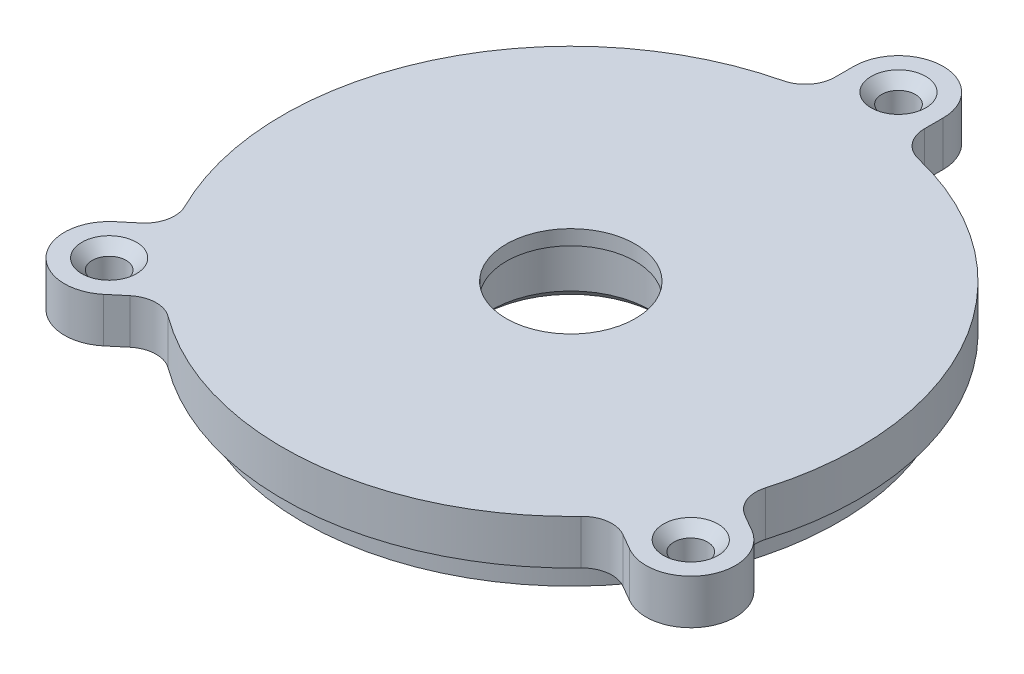
ISO-10303-21;
HEADER;
FILE_DESCRIPTION(('STEP AP214'),'2;1');
FILE_NAME('part.step','',(''),(''),'','','');
FILE_SCHEMA(('AUTOMOTIVE_DESIGN { 1 0 10303 214 1 1 1 1 }'));
ENDSEC;
DATA;
#1=APPLICATION_CONTEXT('core data for automotive mechanical design processes');
#2=APPLICATION_PROTOCOL_DEFINITION('international standard','automotive_design',2000,#1);
#3=PRODUCT_CONTEXT('',#1,'mechanical');
#4=PRODUCT('Part','Part','',(#3));
#5=PRODUCT_RELATED_PRODUCT_CATEGORY('part','',(#4));
#6=PRODUCT_DEFINITION_FORMATION('','',#4);
#7=PRODUCT_DEFINITION_CONTEXT('part definition',#1,'design');
#8=PRODUCT_DEFINITION('design','',#6,#7);
#9=PRODUCT_DEFINITION_SHAPE('','',#8);
#10=(LENGTH_UNIT() NAMED_UNIT(*) SI_UNIT(.MILLI.,.METRE.));
#11=(NAMED_UNIT(*) PLANE_ANGLE_UNIT() SI_UNIT($,.RADIAN.));
#12=(NAMED_UNIT(*) SI_UNIT($,.STERADIAN.) SOLID_ANGLE_UNIT());
#13=UNCERTAINTY_MEASURE_WITH_UNIT(LENGTH_MEASURE(1.E-05),#10,'distance_accuracy_value','');
#14=(GEOMETRIC_REPRESENTATION_CONTEXT(3) GLOBAL_UNCERTAINTY_ASSIGNED_CONTEXT((#13)) GLOBAL_UNIT_ASSIGNED_CONTEXT((#10,
#11,#12)) REPRESENTATION_CONTEXT('',''));
#15=CARTESIAN_POINT('',(0.,0.,0.));
#16=DIRECTION('',(0.,0.,1.));
#17=DIRECTION('',(1.,0.,0.));
#18=AXIS2_PLACEMENT_3D('',#15,#16,#17);
#19=CARTESIAN_POINT('',(0.,16.3185634778856,0.));
#20=DIRECTION('',(0.,1.,0.));
#21=DIRECTION('',(0.,0.,1.));
#22=AXIS2_PLACEMENT_3D('',#19,#20,#21);
#23=CYLINDRICAL_SURFACE('',#22,29.);
#24=CARTESIAN_POINT('',(0.,7.5,0.));
#25=DIRECTION('',(0.,1.,0.));
#26=DIRECTION('',(0.,0.,1.));
#27=AXIS2_PLACEMENT_3D('',#24,#25,#26);
#28=CIRCLE('',#27,29.);
#29=CARTESIAN_POINT('',(-17.2275630338086,7.5,23.3283319574322));
#30=VERTEX_POINT('',#29);
#31=CARTESIAN_POINT('',(21.0167599736183,7.5,19.9823872500589));
#32=VERTEX_POINT('',#31);
#33=EDGE_CURVE('E261',#30,#32,#28,.T.);
#34=ORIENTED_EDGE('',*,*,#33,.F.);
#35=DIRECTION('',(0.,1.,0.));
#36=VECTOR('',#35,1.);
#37=CARTESIAN_POINT('',(-17.2275630338086,16.3185634778856,23.3283319574322));
#38=LINE('',#37,#36);
#39=CARTESIAN_POINT('',(-17.2275630338086,3.,23.3283319574322));
#40=VERTEX_POINT('',#39);
#41=EDGE_CURVE('E66',#30,#40,#38,.F.);
#42=ORIENTED_EDGE('',*,*,#41,.T.);
#43=CARTESIAN_POINT('',(0.,3.,0.));
#44=DIRECTION('',(0.,1.,0.));
#45=DIRECTION('',(0.,0.,1.));
#46=AXIS2_PLACEMENT_3D('',#43,#44,#45);
#47=CIRCLE('',#46,29.);
#48=CARTESIAN_POINT('',(21.0167599736183,3.,19.9823872500589));
#49=VERTEX_POINT('',#48);
#50=EDGE_CURVE('E256',#40,#49,#47,.T.);
#51=ORIENTED_EDGE('',*,*,#50,.T.);
#52=DIRECTION('',(0.,1.,0.));
#53=VECTOR('',#52,1.);
#54=CARTESIAN_POINT('',(21.0167599736183,16.3185634778856,19.9823872500589));
#55=LINE('',#54,#53);
#56=EDGE_CURVE('E298',#49,#32,#55,.T.);
#57=ORIENTED_EDGE('',*,*,#56,.T.);
#58=EDGE_LOOP('',(#34,#42,#51,#57));
#59=FACE_BOUND('',#58,.T.);
#60=ADVANCED_FACE('F43',(#59),#23,.T.);
#61=CARTESIAN_POINT('',(27.8136349736183,7.5,8.20985441736422));
#62=VERTEX_POINT('',#61);
#63=CARTESIAN_POINT('',(6.796875,7.5,-28.1922416674229));
#64=VERTEX_POINT('',#63);
#65=EDGE_CURVE('E255',#62,#64,#28,.T.);
#66=ORIENTED_EDGE('',*,*,#65,.F.);
#67=DIRECTION('',(0.,1.,0.));
#68=VECTOR('',#67,1.);
#69=CARTESIAN_POINT('',(27.8136349736183,16.3185634778856,8.20985441736421));
#70=LINE('',#69,#68);
#71=CARTESIAN_POINT('',(27.8136349736183,3.,8.20985441736422));
#72=VERTEX_POINT('',#71);
#73=EDGE_CURVE('E306',#62,#72,#70,.F.);
#74=ORIENTED_EDGE('',*,*,#73,.T.);
#75=CARTESIAN_POINT('',(6.796875,3.,-28.1922416674229));
#76=VERTEX_POINT('',#75);
#77=EDGE_CURVE('E251',#72,#76,#47,.T.);
#78=ORIENTED_EDGE('',*,*,#77,.T.);
#79=DIRECTION('',(0.,1.,0.));
#80=VECTOR('',#79,1.);
#81=CARTESIAN_POINT('',(6.796875,16.3185634778856,-28.1922416674229));
#82=LINE('',#81,#80);
#83=EDGE_CURVE('E281',#76,#64,#82,.T.);
#84=ORIENTED_EDGE('',*,*,#83,.T.);
#85=EDGE_LOOP('',(#66,#74,#78,#84));
#86=FACE_BOUND('',#85,.T.);
#87=ADVANCED_FACE('F363',(#86),#23,.T.);
#88=CARTESIAN_POINT('',(0.,16.3185634778856,0.));
#89=DIRECTION('',(0.,1.,0.));
#90=DIRECTION('',(0.,0.,1.));
#91=AXIS2_PLACEMENT_3D('',#88,#89,#90);
#92=CYLINDRICAL_SURFACE('',#91,27.);
#93=CARTESIAN_POINT('',(0.,3.,0.));
#94=DIRECTION('',(0.,1.,0.));
#95=DIRECTION('',(0.,0.,1.));
#96=AXIS2_PLACEMENT_3D('',#93,#94,#95);
#97=CIRCLE('',#96,27.);
#98=CARTESIAN_POINT('',(0.,3.,27.));
#99=VERTEX_POINT('',#98);
#100=EDGE_CURVE('E248',#99,#99,#97,.T.);
#101=ORIENTED_EDGE('',*,*,#100,.F.);
#102=EDGE_LOOP('',(#101));
#103=FACE_BOUND('',#102,.T.);
#104=CARTESIAN_POINT('',(0.,0.,0.));
#105=DIRECTION('',(0.,1.,0.));
#106=DIRECTION('',(0.,0.,1.));
#107=AXIS2_PLACEMENT_3D('',#104,#105,#106);
#108=CIRCLE('',#107,27.);
#109=CARTESIAN_POINT('',(0.,0.,27.));
#110=VERTEX_POINT('',#109);
#111=EDGE_CURVE('E276',#110,#110,#108,.T.);
#112=ORIENTED_EDGE('',*,*,#111,.T.);
#113=EDGE_LOOP('',(#112));
#114=FACE_BOUND('',#113,.T.);
#115=ADVANCED_FACE('F370',(#103,#114),#92,.T.);
#116=CARTESIAN_POINT('',(9.,0.,0.));
#117=DIRECTION('',(0.,1.,0.));
#118=DIRECTION('',(0.,0.,1.));
#119=AXIS2_PLACEMENT_3D('',#116,#117,#118);
#120=PLANE('',#119);
#121=ORIENTED_EDGE('',*,*,#111,.F.);
#122=EDGE_LOOP('',(#121));
#123=FACE_BOUND('',#122,.T.);
#124=CARTESIAN_POINT('',(0.,0.,0.));
#125=DIRECTION('',(0.,1.,0.));
#126=DIRECTION('',(0.,0.,1.));
#127=AXIS2_PLACEMENT_3D('',#124,#125,#126);
#128=CIRCLE('',#127,9.);
#129=CARTESIAN_POINT('',(0.,0.,9.));
#130=VERTEX_POINT('',#129);
#131=EDGE_CURVE('E273',#130,#130,#128,.T.);
#132=ORIENTED_EDGE('',*,*,#131,.T.);
#133=EDGE_LOOP('',(#132));
#134=FACE_BOUND('',#133,.T.);
#135=ADVANCED_FACE('F436',(#123,#134),#120,.F.);
#136=CARTESIAN_POINT('',(0.,1.,0.));
#137=DIRECTION('',(0.,-1.,0.));
#138=DIRECTION('',(0.,0.,-1.));
#139=AXIS2_PLACEMENT_3D('',#136,#137,#138);
#140=CONICAL_SURFACE('',#139,8.,0.785398163397446);
#141=ORIENTED_EDGE('',*,*,#131,.F.);
#142=EDGE_LOOP('',(#141));
#143=FACE_BOUND('',#142,.T.);
#144=CARTESIAN_POINT('',(0.,1.,0.));
#145=DIRECTION('',(0.,1.,0.));
#146=DIRECTION('',(0.,0.,1.));
#147=AXIS2_PLACEMENT_3D('',#144,#145,#146);
#148=CIRCLE('',#147,8.);
#149=CARTESIAN_POINT('',(0.,1.,8.));
#150=VERTEX_POINT('',#149);
#151=EDGE_CURVE('E270',#150,#150,#148,.T.);
#152=ORIENTED_EDGE('',*,*,#151,.T.);
#153=EDGE_LOOP('',(#152));
#154=FACE_BOUND('',#153,.T.);
#155=ADVANCED_FACE('F440',(#143,#154),#140,.F.);
#156=CARTESIAN_POINT('',(0.,16.3185634778856,0.));
#157=DIRECTION('',(0.,1.,0.));
#158=DIRECTION('',(0.,0.,1.));
#159=AXIS2_PLACEMENT_3D('',#156,#157,#158);
#160=CYLINDRICAL_SURFACE('',#159,8.);
#161=ORIENTED_EDGE('',*,*,#151,.F.);
#162=EDGE_LOOP('',(#161));
#163=FACE_BOUND('',#162,.T.);
#164=CARTESIAN_POINT('',(0.,6.,0.));
#165=DIRECTION('',(0.,1.,0.));
#166=DIRECTION('',(0.,0.,1.));
#167=AXIS2_PLACEMENT_3D('',#164,#165,#166);
#168=CIRCLE('',#167,8.);
#169=CARTESIAN_POINT('',(0.,6.,8.));
#170=VERTEX_POINT('',#169);
#171=EDGE_CURVE('E267',#170,#170,#168,.T.);
#172=ORIENTED_EDGE('',*,*,#171,.T.);
#173=EDGE_LOOP('',(#172));
#174=FACE_BOUND('',#173,.T.);
#175=ADVANCED_FACE('F444',(#163,#174),#160,.F.);
#176=CARTESIAN_POINT('',(6.5,6.,0.));
#177=DIRECTION('',(0.,1.,0.));
#178=DIRECTION('',(0.,0.,1.));
#179=AXIS2_PLACEMENT_3D('',#176,#177,#178);
#180=PLANE('',#179);
#181=ORIENTED_EDGE('',*,*,#171,.F.);
#182=EDGE_LOOP('',(#181));
#183=FACE_BOUND('',#182,.T.);
#184=CARTESIAN_POINT('',(0.,6.,0.));
#185=DIRECTION('',(0.,1.,0.));
#186=DIRECTION('',(0.,0.,1.));
#187=AXIS2_PLACEMENT_3D('',#184,#185,#186);
#188=CIRCLE('',#187,6.5);
#189=CARTESIAN_POINT('',(0.,6.,6.5));
#190=VERTEX_POINT('',#189);
#191=EDGE_CURVE('E264',#190,#190,#188,.T.);
#192=ORIENTED_EDGE('',*,*,#191,.T.);
#193=EDGE_LOOP('',(#192));
#194=FACE_BOUND('',#193,.T.);
#195=ADVANCED_FACE('F448',(#183,#194),#180,.F.);
#196=CARTESIAN_POINT('',(0.,16.3185634778856,0.));
#197=DIRECTION('',(0.,1.,0.));
#198=DIRECTION('',(0.,0.,1.));
#199=AXIS2_PLACEMENT_3D('',#196,#197,#198);
#200=CYLINDRICAL_SURFACE('',#199,6.5);
#201=ORIENTED_EDGE('',*,*,#191,.F.);
#202=EDGE_LOOP('',(#201));
#203=FACE_BOUND('',#202,.T.);
#204=CARTESIAN_POINT('',(0.,7.5,0.));
#205=DIRECTION('',(0.,1.,0.));
#206=DIRECTION('',(0.,0.,1.));
#207=AXIS2_PLACEMENT_3D('',#204,#205,#206);
#208=CIRCLE('',#207,6.5);
#209=CARTESIAN_POINT('',(0.,7.5,6.5));
#210=VERTEX_POINT('',#209);
#211=EDGE_CURVE('E260',#210,#210,#208,.T.);
#212=ORIENTED_EDGE('',*,*,#211,.T.);
#213=EDGE_LOOP('',(#212));
#214=FACE_BOUND('',#213,.T.);
#215=ADVANCED_FACE('F383',(#203,#214),#200,.F.);
#216=CARTESIAN_POINT('',(29.,7.5,0.));
#217=DIRECTION('',(0.,-1.,0.));
#218=DIRECTION('',(0.,0.,-1.));
#219=AXIS2_PLACEMENT_3D('',#216,#217,#218);
#220=PLANE('',#219);
#221=CARTESIAN_POINT('',(-25.2794666229265,7.5,21.2119911196556));
#222=DIRECTION('',(0.,-1.,0.));
#223=DIRECTION('',(0.,0.,-1.));
#224=AXIS2_PLACEMENT_3D('',#221,#222,#223);
#225=CIRCLE('',#224,2.75);
#226=CARTESIAN_POINT('',(-25.2794666229265,7.5,18.4619911196556));
#227=VERTEX_POINT('',#226);
#228=EDGE_CURVE('E340',#227,#227,#225,.T.);
#229=ORIENTED_EDGE('',*,*,#228,.T.);
#230=EDGE_LOOP('',(#229));
#231=FACE_BOUND('',#230,.T.);
#232=CARTESIAN_POINT('',(28.5788383248864,7.5,16.5000000000001));
#233=DIRECTION('',(0.,-1.,0.));
#234=DIRECTION('',(0.,0.,-1.));
#235=AXIS2_PLACEMENT_3D('',#232,#233,#234);
#236=CIRCLE('',#235,2.75000000000001);
#237=CARTESIAN_POINT('',(28.5788383248864,7.5,13.7500000000001));
#238=VERTEX_POINT('',#237);
#239=EDGE_CURVE('E337',#238,#238,#236,.T.);
#240=ORIENTED_EDGE('',*,*,#239,.T.);
#241=EDGE_LOOP('',(#240));
#242=FACE_BOUND('',#241,.T.);
#243=CARTESIAN_POINT('',(0.,7.5,-33.));
#244=DIRECTION('',(0.,-1.,0.));
#245=DIRECTION('',(0.,0.,-1.));
#246=AXIS2_PLACEMENT_3D('',#243,#244,#245);
#247=CIRCLE('',#246,2.74999999999999);
#248=CARTESIAN_POINT('',(0.,7.5,-35.75));
#249=VERTEX_POINT('',#248);
#250=EDGE_CURVE('E334',#249,#249,#247,.T.);
#251=ORIENTED_EDGE('',*,*,#250,.T.);
#252=EDGE_LOOP('',(#251));
#253=FACE_BOUND('',#252,.T.);
#254=ORIENTED_EDGE('',*,*,#211,.F.);
#255=EDGE_LOOP('',(#254));
#256=FACE_BOUND('',#255,.T.);
#257=DIRECTION('',(0.,0.,1.));
#258=VECTOR('',#257,1.);
#259=CARTESIAN_POINT('',(-4.5,7.5,-33.));
#260=LINE('',#259,#258);
#261=CARTESIAN_POINT('',(-4.5,7.5,-33.));
#262=VERTEX_POINT('',#261);
#263=CARTESIAN_POINT('',(-4.5,7.5,-31.1086804606046));
#264=VERTEX_POINT('',#263);
#265=EDGE_CURVE('E238',#262,#264,#260,.T.);
#266=ORIENTED_EDGE('',*,*,#265,.T.);
#267=CARTESIAN_POINT('',(-7.5,7.5,-31.1086804606046));
#268=DIRECTION('',(0.,-1.,0.));
#269=DIRECTION('',(0.,0.,-1.));
#270=AXIS2_PLACEMENT_3D('',#267,#268,#269);
#271=CIRCLE('',#270,3.);
#272=CARTESIAN_POINT('',(-6.796875,7.5,-28.1922416674229));
#273=VERTEX_POINT('',#272);
#274=EDGE_CURVE('E294',#264,#273,#271,.T.);
#275=ORIENTED_EDGE('',*,*,#274,.T.);
#276=CARTESIAN_POINT('',(-25.9654571029849,7.5,12.9149153087835));
#277=VERTEX_POINT('',#276);
#278=EDGE_CURVE('E257',#273,#277,#28,.T.);
#279=ORIENTED_EDGE('',*,*,#278,.T.);
#280=CARTESIAN_POINT('',(-28.6515388722592,7.5,14.2509410303818));
#281=DIRECTION('',(0.,-1.,0.));
#282=DIRECTION('',(0.,0.,-1.));
#283=AXIS2_PLACEMENT_3D('',#280,#281,#282);
#284=CIRCLE('',#283,3.);
#285=CARTESIAN_POINT('',(-26.7231760431996,7.5,16.5490743597387));
#286=VERTEX_POINT('',#285);
#287=EDGE_CURVE('E324',#277,#286,#284,.T.);
#288=ORIENTED_EDGE('',*,*,#287,.T.);
#289=DIRECTION('',(-0.766044443118984,0.,0.642787609686532));
#290=VECTOR('',#289,1.);
#291=CARTESIAN_POINT('',(-28.1720108665159,7.5,17.7647911256201));
#292=LINE('',#291,#290);
#293=CARTESIAN_POINT('',(-28.1720108665159,7.5,17.7647911256201));
#294=VERTEX_POINT('',#293);
#295=EDGE_CURVE('E180',#286,#294,#292,.T.);
#296=ORIENTED_EDGE('',*,*,#295,.T.);
#297=CARTESIAN_POINT('',(-25.2794666229265,7.5,21.2119911196556));
#298=DIRECTION('',(0.,1.,0.));
#299=DIRECTION('',(0.766044443118984,0.,-0.642787609686532));
#300=AXIS2_PLACEMENT_3D('',#297,#298,#299);
#301=CIRCLE('',#300,4.5);
#302=CARTESIAN_POINT('',(-22.3869223793371,7.5,24.659191113691));
#303=VERTEX_POINT('',#302);
#304=EDGE_CURVE('E175',#294,#303,#301,.T.);
#305=ORIENTED_EDGE('',*,*,#304,.T.);
#306=DIRECTION('',(0.766044443118984,0.,-0.642787609686532));
#307=VECTOR('',#306,1.);
#308=CARTESIAN_POINT('',(-22.3869223793371,7.5,24.659191113691));
#309=LINE('',#308,#307);
#310=CARTESIAN_POINT('',(-20.9380875560209,7.5,23.4434743478096));
#311=VERTEX_POINT('',#310);
#312=EDGE_CURVE('E183',#303,#311,#309,.T.);
#313=ORIENTED_EDGE('',*,*,#312,.T.);
#314=CARTESIAN_POINT('',(-19.0097247269613,7.5,25.7416076771665));
#315=DIRECTION('',(0.,-1.,0.));
#316=DIRECTION('',(0.,0.,-1.));
#317=AXIS2_PLACEMENT_3D('',#314,#315,#316);
#318=CIRCLE('',#317,3.);
#319=EDGE_CURVE('E59',#311,#30,#318,.T.);
#320=ORIENTED_EDGE('',*,*,#319,.T.);
#321=ORIENTED_EDGE('',*,*,#33,.T.);
#322=CARTESIAN_POINT('',(23.190907557096,7.5,22.0495307586857));
#323=DIRECTION('',(0.,-1.,0.));
#324=DIRECTION('',(0.,0.,-1.));
#325=AXIS2_PLACEMENT_3D('',#322,#323,#324);
#326=CIRCLE('',#325,3.);
#327=CARTESIAN_POINT('',(24.690907557096,7.5,19.4514545473324));
#328=VERTEX_POINT('',#327);
#329=EDGE_CURVE('E308',#32,#328,#326,.T.);
#330=ORIENTED_EDGE('',*,*,#329,.T.);
#331=DIRECTION('',(0.866025403784436,0.,0.500000000000004));
#332=VECTOR('',#331,1.);
#333=CARTESIAN_POINT('',(26.3288383248864,7.5,20.3971143170301));
#334=LINE('',#333,#332);
#335=CARTESIAN_POINT('',(26.3288383248864,7.5,20.3971143170301));
#336=VERTEX_POINT('',#335);
#337=EDGE_CURVE('E218',#328,#336,#334,.T.);
#338=ORIENTED_EDGE('',*,*,#337,.T.);
#339=CARTESIAN_POINT('',(28.5788383248864,7.5,16.5000000000001));
#340=DIRECTION('',(0.,1.,0.));
#341=DIRECTION('',(-0.866025403784436,0.,-0.500000000000004));
#342=AXIS2_PLACEMENT_3D('',#339,#340,#341);
#343=CIRCLE('',#342,4.5);
#344=CARTESIAN_POINT('',(30.8288383248864,7.5,12.6028856829702));
#345=VERTEX_POINT('',#344);
#346=EDGE_CURVE('E202',#336,#345,#343,.T.);
#347=ORIENTED_EDGE('',*,*,#346,.T.);
#348=DIRECTION('',(-0.866025403784437,0.,-0.500000000000004));
#349=VECTOR('',#348,1.);
#350=CARTESIAN_POINT('',(30.8288383248864,7.5,12.6028856829702));
#351=LINE('',#350,#349);
#352=CARTESIAN_POINT('',(29.1909075570961,7.5,11.6572259132724));
#353=VERTEX_POINT('',#352);
#354=EDGE_CURVE('E215',#345,#353,#351,.T.);
#355=ORIENTED_EDGE('',*,*,#354,.T.);
#356=CARTESIAN_POINT('',(30.6909075570961,7.5,9.05914970191913));
#357=DIRECTION('',(0.,-1.,0.));
#358=DIRECTION('',(0.,0.,-1.));
#359=AXIS2_PLACEMENT_3D('',#356,#357,#358);
#360=CIRCLE('',#359,3.);
#361=EDGE_CURVE('E313',#353,#62,#360,.T.);
#362=ORIENTED_EDGE('',*,*,#361,.T.);
#363=ORIENTED_EDGE('',*,*,#65,.T.);
#364=CARTESIAN_POINT('',(7.5,7.5,-31.1086804606046));
#365=DIRECTION('',(0.,-1.,0.));
#366=DIRECTION('',(0.,0.,-1.));
#367=AXIS2_PLACEMENT_3D('',#364,#365,#366);
#368=CIRCLE('',#367,3.);
#369=CARTESIAN_POINT('',(4.5,7.5,-31.1086804606046));
#370=VERTEX_POINT('',#369);
#371=EDGE_CURVE('E289',#64,#370,#368,.T.);
#372=ORIENTED_EDGE('',*,*,#371,.T.);
#373=DIRECTION('',(0.,0.,-1.));
#374=VECTOR('',#373,1.);
#375=CARTESIAN_POINT('',(4.5,7.5,-33.));
#376=LINE('',#375,#374);
#377=CARTESIAN_POINT('',(4.5,7.5,-33.));
#378=VERTEX_POINT('',#377);
#379=EDGE_CURVE('E240',#370,#378,#376,.T.);
#380=ORIENTED_EDGE('',*,*,#379,.T.);
#381=CARTESIAN_POINT('',(0.,7.5,-33.));
#382=DIRECTION('',(0.,1.,0.));
#383=DIRECTION('',(0.,0.,1.));
#384=AXIS2_PLACEMENT_3D('',#381,#382,#383);
#385=CIRCLE('',#384,4.5);
#386=EDGE_CURVE('E226',#378,#262,#385,.T.);
#387=ORIENTED_EDGE('',*,*,#386,.T.);
#388=EDGE_LOOP('',(#266,#275,#279,#288,#296,#305,#313,#320,#321,#330,#338,#347,#355,#362,#363,
#372,#380,#387));
#389=FACE_BOUND('',#388,.T.);
#390=ADVANCED_FACE('F189',(#231,#242,#253,#256,#389),#220,.F.);
#391=CARTESIAN_POINT('',(-6.796875,3.,-28.1922416674229));
#392=VERTEX_POINT('',#391);
#393=CARTESIAN_POINT('',(-25.9654571029849,3.,12.9149153087835));
#394=VERTEX_POINT('',#393);
#395=EDGE_CURVE('E252',#392,#394,#47,.T.);
#396=ORIENTED_EDGE('',*,*,#395,.T.);
#397=DIRECTION('',(0.,1.,0.));
#398=VECTOR('',#397,1.);
#399=CARTESIAN_POINT('',(-25.9654571029849,16.3185634778856,12.9149153087835));
#400=LINE('',#399,#398);
#401=EDGE_CURVE('E317',#394,#277,#400,.T.);
#402=ORIENTED_EDGE('',*,*,#401,.T.);
#403=ORIENTED_EDGE('',*,*,#278,.F.);
#404=DIRECTION('',(0.,1.,0.));
#405=VECTOR('',#404,1.);
#406=CARTESIAN_POINT('',(-6.796875,16.3185634778856,-28.1922416674229));
#407=LINE('',#406,#405);
#408=EDGE_CURVE('E279',#273,#392,#407,.F.);
#409=ORIENTED_EDGE('',*,*,#408,.T.);
#410=EDGE_LOOP('',(#396,#402,#403,#409));
#411=FACE_BOUND('',#410,.T.);
#412=ADVANCED_FACE('F365',(#411),#23,.T.);
#413=CARTESIAN_POINT('',(27.,3.,0.));
#414=DIRECTION('',(0.,1.,0.));
#415=DIRECTION('',(0.,0.,1.));
#416=AXIS2_PLACEMENT_3D('',#413,#414,#415);
#417=PLANE('',#416);
#418=ORIENTED_EDGE('',*,*,#395,.F.);
#419=CARTESIAN_POINT('',(-7.5,3.,-31.1086804606046));
#420=DIRECTION('',(0.,1.,0.));
#421=DIRECTION('',(0.,0.,1.));
#422=AXIS2_PLACEMENT_3D('',#419,#420,#421);
#423=CIRCLE('',#422,3.);
#424=CARTESIAN_POINT('',(-4.5,3.,-31.1086804606046));
#425=VERTEX_POINT('',#424);
#426=EDGE_CURVE('E296',#392,#425,#423,.T.);
#427=ORIENTED_EDGE('',*,*,#426,.T.);
#428=DIRECTION('',(0.,0.,-1.));
#429=VECTOR('',#428,1.);
#430=CARTESIAN_POINT('',(-4.5,3.,-33.));
#431=LINE('',#430,#429);
#432=CARTESIAN_POINT('',(-4.5,3.,-33.));
#433=VERTEX_POINT('',#432);
#434=EDGE_CURVE('E227',#425,#433,#431,.T.);
#435=ORIENTED_EDGE('',*,*,#434,.T.);
#436=CARTESIAN_POINT('',(0.,3.,-33.));
#437=DIRECTION('',(0.,1.,0.));
#438=DIRECTION('',(0.,0.,1.));
#439=AXIS2_PLACEMENT_3D('',#436,#437,#438);
#440=CIRCLE('',#439,4.5);
#441=CARTESIAN_POINT('',(4.5,3.,-33.));
#442=VERTEX_POINT('',#441);
#443=EDGE_CURVE('E230',#433,#442,#440,.F.);
#444=ORIENTED_EDGE('',*,*,#443,.T.);
#445=DIRECTION('',(0.,0.,1.));
#446=VECTOR('',#445,1.);
#447=CARTESIAN_POINT('',(4.5,3.,-33.));
#448=LINE('',#447,#446);
#449=CARTESIAN_POINT('',(4.5,3.,-31.1086804606046));
#450=VERTEX_POINT('',#449);
#451=EDGE_CURVE('E231',#442,#450,#448,.T.);
#452=ORIENTED_EDGE('',*,*,#451,.T.);
#453=CARTESIAN_POINT('',(7.5,3.,-31.1086804606046));
#454=DIRECTION('',(0.,1.,0.));
#455=DIRECTION('',(0.,0.,1.));
#456=AXIS2_PLACEMENT_3D('',#453,#454,#455);
#457=CIRCLE('',#456,3.);
#458=EDGE_CURVE('E291',#450,#76,#457,.T.);
#459=ORIENTED_EDGE('',*,*,#458,.T.);
#460=ORIENTED_EDGE('',*,*,#77,.F.);
#461=CARTESIAN_POINT('',(30.6909075570961,3.,9.05914970191913));
#462=DIRECTION('',(0.,1.,0.));
#463=DIRECTION('',(0.,0.,1.));
#464=AXIS2_PLACEMENT_3D('',#461,#462,#463);
#465=CIRCLE('',#464,3.);
#466=CARTESIAN_POINT('',(29.1909075570961,3.,11.6572259132724));
#467=VERTEX_POINT('',#466);
#468=EDGE_CURVE('E315',#72,#467,#465,.T.);
#469=ORIENTED_EDGE('',*,*,#468,.T.);
#470=DIRECTION('',(0.866025403784436,0.,0.500000000000004));
#471=VECTOR('',#470,1.);
#472=CARTESIAN_POINT('',(30.8288383248864,3.,12.6028856829702));
#473=LINE('',#472,#471);
#474=CARTESIAN_POINT('',(30.8288383248864,3.,12.6028856829702));
#475=VERTEX_POINT('',#474);
#476=EDGE_CURVE('E204',#467,#475,#473,.T.);
#477=ORIENTED_EDGE('',*,*,#476,.T.);
#478=CARTESIAN_POINT('',(28.5788383248864,3.,16.5000000000001));
#479=DIRECTION('',(0.,1.,0.));
#480=DIRECTION('',(0.,0.,1.));
#481=AXIS2_PLACEMENT_3D('',#478,#479,#480);
#482=CIRCLE('',#481,4.5);
#483=CARTESIAN_POINT('',(26.3288383248864,3.,20.3971143170301));
#484=VERTEX_POINT('',#483);
#485=EDGE_CURVE('E207',#475,#484,#482,.F.);
#486=ORIENTED_EDGE('',*,*,#485,.T.);
#487=DIRECTION('',(-0.866025403784436,0.,-0.500000000000004));
#488=VECTOR('',#487,1.);
#489=CARTESIAN_POINT('',(26.3288383248864,3.,20.3971143170301));
#490=LINE('',#489,#488);
#491=CARTESIAN_POINT('',(24.690907557096,3.,19.4514545473324));
#492=VERTEX_POINT('',#491);
#493=EDGE_CURVE('E208',#484,#492,#490,.T.);
#494=ORIENTED_EDGE('',*,*,#493,.T.);
#495=CARTESIAN_POINT('',(23.190907557096,3.,22.0495307586857));
#496=DIRECTION('',(0.,1.,0.));
#497=DIRECTION('',(0.,0.,1.));
#498=AXIS2_PLACEMENT_3D('',#495,#496,#497);
#499=CIRCLE('',#498,3.);
#500=EDGE_CURVE('E310',#492,#49,#499,.T.);
#501=ORIENTED_EDGE('',*,*,#500,.T.);
#502=ORIENTED_EDGE('',*,*,#50,.F.);
#503=CARTESIAN_POINT('',(-19.0097247269613,3.,25.7416076771665));
#504=DIRECTION('',(0.,1.,0.));
#505=DIRECTION('',(0.,0.,1.));
#506=AXIS2_PLACEMENT_3D('',#503,#504,#505);
#507=CIRCLE('',#506,3.);
#508=CARTESIAN_POINT('',(-20.9380875560209,3.,23.4434743478096));
#509=VERTEX_POINT('',#508);
#510=EDGE_CURVE('E329',#40,#509,#507,.T.);
#511=ORIENTED_EDGE('',*,*,#510,.T.);
#512=DIRECTION('',(-0.766044443118984,0.,0.642787609686532));
#513=VECTOR('',#512,1.);
#514=CARTESIAN_POINT('',(-22.3869223793371,3.,24.659191113691));
#515=LINE('',#514,#513);
#516=CARTESIAN_POINT('',(-22.3869223793371,3.,24.659191113691));
#517=VERTEX_POINT('',#516);
#518=EDGE_CURVE('E203',#509,#517,#515,.T.);
#519=ORIENTED_EDGE('',*,*,#518,.T.);
#520=CARTESIAN_POINT('',(-25.2794666229265,3.,21.2119911196556));
#521=DIRECTION('',(0.,1.,0.));
#522=DIRECTION('',(0.,0.,1.));
#523=AXIS2_PLACEMENT_3D('',#520,#521,#522);
#524=CIRCLE('',#523,4.5);
#525=CARTESIAN_POINT('',(-28.1720108665159,3.,17.7647911256201));
#526=VERTEX_POINT('',#525);
#527=EDGE_CURVE('E176',#517,#526,#524,.F.);
#528=ORIENTED_EDGE('',*,*,#527,.T.);
#529=DIRECTION('',(0.766044443118984,0.,-0.642787609686532));
#530=VECTOR('',#529,1.);
#531=CARTESIAN_POINT('',(-28.1720108665159,3.,17.7647911256201));
#532=LINE('',#531,#530);
#533=CARTESIAN_POINT('',(-26.7231760431996,3.,16.5490743597387));
#534=VERTEX_POINT('',#533);
#535=EDGE_CURVE('E197',#526,#534,#532,.T.);
#536=ORIENTED_EDGE('',*,*,#535,.T.);
#537=CARTESIAN_POINT('',(-28.6515388722592,3.,14.2509410303818));
#538=DIRECTION('',(0.,1.,0.));
#539=DIRECTION('',(0.,0.,1.));
#540=AXIS2_PLACEMENT_3D('',#537,#538,#539);
#541=CIRCLE('',#540,3.);
#542=EDGE_CURVE('E326',#534,#394,#541,.T.);
#543=ORIENTED_EDGE('',*,*,#542,.T.);
#544=EDGE_LOOP('',(#418,#427,#435,#444,#452,#459,#460,#469,#477,#486,#494,#501,#502,#511,#519,
#528,#536,#543));
#545=FACE_BOUND('',#544,.T.);
#546=ORIENTED_EDGE('',*,*,#100,.T.);
#547=EDGE_LOOP('',(#546));
#548=FACE_BOUND('',#547,.T.);
#549=CARTESIAN_POINT('',(0.,3.,-33.));
#550=DIRECTION('',(0.,1.,0.));
#551=DIRECTION('',(0.,0.,1.));
#552=AXIS2_PLACEMENT_3D('',#549,#550,#551);
#553=CIRCLE('',#552,1.7);
#554=CARTESIAN_POINT('',(0.,3.,-31.3));
#555=VERTEX_POINT('',#554);
#556=EDGE_CURVE('E229',#555,#555,#553,.F.);
#557=ORIENTED_EDGE('',*,*,#556,.F.);
#558=EDGE_LOOP('',(#557));
#559=FACE_BOUND('',#558,.T.);
#560=CARTESIAN_POINT('',(28.5788383248864,3.,16.5000000000001));
#561=DIRECTION('',(0.,1.,0.));
#562=DIRECTION('',(0.,0.,1.));
#563=AXIS2_PLACEMENT_3D('',#560,#561,#562);
#564=CIRCLE('',#563,1.7);
#565=CARTESIAN_POINT('',(28.5788383248864,3.,18.2000000000001));
#566=VERTEX_POINT('',#565);
#567=EDGE_CURVE('E206',#566,#566,#564,.F.);
#568=ORIENTED_EDGE('',*,*,#567,.F.);
#569=EDGE_LOOP('',(#568));
#570=FACE_BOUND('',#569,.T.);
#571=CARTESIAN_POINT('',(-25.2794666229265,3.,21.2119911196556));
#572=DIRECTION('',(0.,1.,0.));
#573=DIRECTION('',(0.,0.,1.));
#574=AXIS2_PLACEMENT_3D('',#571,#572,#573);
#575=CIRCLE('',#574,1.7);
#576=CARTESIAN_POINT('',(-25.2794666229265,3.,22.9119911196556));
#577=VERTEX_POINT('',#576);
#578=EDGE_CURVE('E199',#577,#577,#575,.F.);
#579=ORIENTED_EDGE('',*,*,#578,.F.);
#580=EDGE_LOOP('',(#579));
#581=FACE_BOUND('',#580,.T.);
#582=ADVANCED_FACE('F375',(#545,#548,#559,#570,#581),#417,.F.);
#583=CARTESIAN_POINT('',(-4.5,-9.62318887537859,-33.));
#584=DIRECTION('',(-1.,0.,0.));
#585=DIRECTION('',(0.,0.,1.));
#586=AXIS2_PLACEMENT_3D('',#583,#584,#585);
#587=PLANE('',#586);
#588=ORIENTED_EDGE('',*,*,#434,.F.);
#589=DIRECTION('',(0.,1.,0.));
#590=VECTOR('',#589,1.);
#591=CARTESIAN_POINT('',(-4.5,-9.62318887537859,-31.1086804606046));
#592=LINE('',#591,#590);
#593=EDGE_CURVE('E286',#425,#264,#592,.T.);
#594=ORIENTED_EDGE('',*,*,#593,.T.);
#595=ORIENTED_EDGE('',*,*,#265,.F.);
#596=DIRECTION('',(0.,1.,0.));
#597=VECTOR('',#596,1.);
#598=CARTESIAN_POINT('',(-4.5,-9.62318887537859,-33.));
#599=LINE('',#598,#597);
#600=EDGE_CURVE('E242',#433,#262,#599,.T.);
#601=ORIENTED_EDGE('',*,*,#600,.F.);
#602=EDGE_LOOP('',(#588,#594,#595,#601));
#603=FACE_BOUND('',#602,.T.);
#604=ADVANCED_FACE('F380',(#603),#587,.T.);
#605=CARTESIAN_POINT('',(4.5,-9.62318887537859,-33.));
#606=DIRECTION('',(1.,0.,0.));
#607=DIRECTION('',(0.,0.,-1.));
#608=AXIS2_PLACEMENT_3D('',#605,#606,#607);
#609=PLANE('',#608);
#610=ORIENTED_EDGE('',*,*,#379,.F.);
#611=DIRECTION('',(0.,1.,0.));
#612=VECTOR('',#611,1.);
#613=CARTESIAN_POINT('',(4.5,-9.62318887537859,-31.1086804606046));
#614=LINE('',#613,#612);
#615=EDGE_CURVE('E284',#370,#450,#614,.F.);
#616=ORIENTED_EDGE('',*,*,#615,.T.);
#617=ORIENTED_EDGE('',*,*,#451,.F.);
#618=DIRECTION('',(0.,1.,0.));
#619=VECTOR('',#618,1.);
#620=CARTESIAN_POINT('',(4.5,-9.62318887537859,-33.));
#621=LINE('',#620,#619);
#622=EDGE_CURVE('E234',#442,#378,#621,.T.);
#623=ORIENTED_EDGE('',*,*,#622,.T.);
#624=EDGE_LOOP('',(#610,#616,#617,#623));
#625=FACE_BOUND('',#624,.T.);
#626=ADVANCED_FACE('F473',(#625),#609,.T.);
#627=CARTESIAN_POINT('',(0.,-9.62318887537859,-33.));
#628=DIRECTION('',(0.,1.,0.));
#629=DIRECTION('',(0.,0.,1.));
#630=AXIS2_PLACEMENT_3D('',#627,#628,#629);
#631=CYLINDRICAL_SURFACE('',#630,4.5);
#632=ORIENTED_EDGE('',*,*,#443,.F.);
#633=ORIENTED_EDGE('',*,*,#600,.T.);
#634=ORIENTED_EDGE('',*,*,#386,.F.);
#635=ORIENTED_EDGE('',*,*,#622,.F.);
#636=EDGE_LOOP('',(#632,#633,#634,#635));
#637=FACE_BOUND('',#636,.T.);
#638=ADVANCED_FACE('F469',(#637),#631,.T.);
#639=CARTESIAN_POINT('',(0.,-9.62318887537859,-33.));
#640=DIRECTION('',(0.,1.,0.));
#641=DIRECTION('',(0.,0.,1.));
#642=AXIS2_PLACEMENT_3D('',#639,#640,#641);
#643=CYLINDRICAL_SURFACE('',#642,1.7);
#644=CARTESIAN_POINT('',(0.,6.45000000000002,-33.));
#645=DIRECTION('',(0.,-1.,0.));
#646=DIRECTION('',(0.,0.,-1.));
#647=AXIS2_PLACEMENT_3D('',#644,#645,#646);
#648=CIRCLE('',#647,1.7);
#649=CARTESIAN_POINT('',(0.,6.45000000000002,-34.7));
#650=VERTEX_POINT('',#649);
#651=EDGE_CURVE('E11',#650,#650,#648,.F.);
#652=ORIENTED_EDGE('',*,*,#651,.T.);
#653=EDGE_LOOP('',(#652));
#654=FACE_BOUND('',#653,.T.);
#655=ORIENTED_EDGE('',*,*,#556,.T.);
#656=EDGE_LOOP('',(#655));
#657=FACE_BOUND('',#656,.T.);
#658=ADVANCED_FACE('F432',(#654,#657),#643,.F.);
#659=CARTESIAN_POINT('',(7.5,16.3185634778856,-31.1086804606046));
#660=DIRECTION('',(0.,1.,0.));
#661=DIRECTION('',(0.,0.,1.));
#662=AXIS2_PLACEMENT_3D('',#659,#660,#661);
#663=CYLINDRICAL_SURFACE('',#662,3.);
#664=ORIENTED_EDGE('',*,*,#458,.F.);
#665=ORIENTED_EDGE('',*,*,#615,.F.);
#666=ORIENTED_EDGE('',*,*,#371,.F.);
#667=ORIENTED_EDGE('',*,*,#83,.F.);
#668=EDGE_LOOP('',(#664,#665,#666,#667));
#669=FACE_BOUND('',#668,.T.);
#670=ADVANCED_FACE('F428',(#669),#663,.F.);
#671=CARTESIAN_POINT('',(-7.5,16.3185634778856,-31.1086804606046));
#672=DIRECTION('',(0.,1.,0.));
#673=DIRECTION('',(0.,0.,1.));
#674=AXIS2_PLACEMENT_3D('',#671,#672,#673);
#675=CYLINDRICAL_SURFACE('',#674,3.);
#676=ORIENTED_EDGE('',*,*,#426,.F.);
#677=ORIENTED_EDGE('',*,*,#408,.F.);
#678=ORIENTED_EDGE('',*,*,#274,.F.);
#679=ORIENTED_EDGE('',*,*,#593,.F.);
#680=EDGE_LOOP('',(#676,#677,#678,#679));
#681=FACE_BOUND('',#680,.T.);
#682=ADVANCED_FACE('F425',(#681),#675,.F.);
#683=CARTESIAN_POINT('',(30.8288383248864,-11.9136764602437,12.6028856829702));
#684=DIRECTION('',(0.500000000000004,0.,-0.866025403784436));
#685=DIRECTION('',(-0.866025403784436,0.,-0.500000000000004));
#686=AXIS2_PLACEMENT_3D('',#683,#684,#685);
#687=PLANE('',#686);
#688=ORIENTED_EDGE('',*,*,#476,.F.);
#689=DIRECTION('',(0.,1.,0.));
#690=VECTOR('',#689,1.);
#691=CARTESIAN_POINT('',(29.1909075570961,-11.9136764602437,11.6572259132724));
#692=LINE('',#691,#690);
#693=EDGE_CURVE('E303',#467,#353,#692,.T.);
#694=ORIENTED_EDGE('',*,*,#693,.T.);
#695=ORIENTED_EDGE('',*,*,#354,.F.);
#696=DIRECTION('',(0.,1.,0.));
#697=VECTOR('',#696,1.);
#698=CARTESIAN_POINT('',(30.8288383248864,-11.9136764602437,12.6028856829702));
#699=LINE('',#698,#697);
#700=EDGE_CURVE('E220',#475,#345,#699,.T.);
#701=ORIENTED_EDGE('',*,*,#700,.F.);
#702=EDGE_LOOP('',(#688,#694,#695,#701));
#703=FACE_BOUND('',#702,.T.);
#704=ADVANCED_FACE('F427',(#703),#687,.T.);
#705=CARTESIAN_POINT('',(26.3288383248864,-11.9136764602437,20.3971143170301));
#706=DIRECTION('',(-0.500000000000004,0.,0.866025403784436));
#707=DIRECTION('',(0.866025403784436,0.,0.500000000000004));
#708=AXIS2_PLACEMENT_3D('',#705,#706,#707);
#709=PLANE('',#708);
#710=ORIENTED_EDGE('',*,*,#337,.F.);
#711=DIRECTION('',(0.,1.,0.));
#712=VECTOR('',#711,1.);
#713=CARTESIAN_POINT('',(24.690907557096,-11.9136764602437,19.4514545473324));
#714=LINE('',#713,#712);
#715=EDGE_CURVE('E301',#328,#492,#714,.F.);
#716=ORIENTED_EDGE('',*,*,#715,.T.);
#717=ORIENTED_EDGE('',*,*,#493,.F.);
#718=DIRECTION('',(0.,1.,0.));
#719=VECTOR('',#718,1.);
#720=CARTESIAN_POINT('',(26.3288383248864,-11.9136764602437,20.3971143170301));
#721=LINE('',#720,#719);
#722=EDGE_CURVE('E211',#484,#336,#721,.T.);
#723=ORIENTED_EDGE('',*,*,#722,.T.);
#724=EDGE_LOOP('',(#710,#716,#717,#723));
#725=FACE_BOUND('',#724,.T.);
#726=ADVANCED_FACE('F543',(#725),#709,.T.);
#727=CARTESIAN_POINT('',(28.5788383248864,-11.9136764602437,16.5000000000001));
#728=DIRECTION('',(0.,1.,0.));
#729=DIRECTION('',(0.,0.,1.));
#730=AXIS2_PLACEMENT_3D('',#727,#728,#729);
#731=CYLINDRICAL_SURFACE('',#730,4.5);
#732=ORIENTED_EDGE('',*,*,#485,.F.);
#733=ORIENTED_EDGE('',*,*,#700,.T.);
#734=ORIENTED_EDGE('',*,*,#346,.F.);
#735=ORIENTED_EDGE('',*,*,#722,.F.);
#736=EDGE_LOOP('',(#732,#733,#734,#735));
#737=FACE_BOUND('',#736,.T.);
#738=ADVANCED_FACE('F553',(#737),#731,.T.);
#739=CARTESIAN_POINT('',(28.5788383248864,-11.9136764602437,16.5000000000001));
#740=DIRECTION('',(0.,1.,0.));
#741=DIRECTION('',(0.,0.,1.));
#742=AXIS2_PLACEMENT_3D('',#739,#740,#741);
#743=CYLINDRICAL_SURFACE('',#742,1.7);
#744=CARTESIAN_POINT('',(28.5788383248864,6.44999999999999,16.5000000000001));
#745=DIRECTION('',(0.,-1.,0.));
#746=DIRECTION('',(0.,0.,-1.));
#747=AXIS2_PLACEMENT_3D('',#744,#745,#746);
#748=CIRCLE('',#747,1.7);
#749=CARTESIAN_POINT('',(28.5788383248864,6.44999999999999,14.8000000000001));
#750=VERTEX_POINT('',#749);
#751=EDGE_CURVE('E52',#750,#750,#748,.F.);
#752=ORIENTED_EDGE('',*,*,#751,.T.);
#753=EDGE_LOOP('',(#752));
#754=FACE_BOUND('',#753,.T.);
#755=ORIENTED_EDGE('',*,*,#567,.T.);
#756=EDGE_LOOP('',(#755));
#757=FACE_BOUND('',#756,.T.);
#758=ADVANCED_FACE('F345',(#754,#757),#743,.F.);
#759=CARTESIAN_POINT('',(-22.3869223793371,-12.1815501267953,24.659191113691));
#760=DIRECTION('',(0.642787609686532,0.,0.766044443118984));
#761=DIRECTION('',(0.766044443118984,0.,-0.642787609686532));
#762=AXIS2_PLACEMENT_3D('',#759,#760,#761);
#763=PLANE('',#762);
#764=ORIENTED_EDGE('',*,*,#518,.F.);
#765=DIRECTION('',(0.,1.,0.));
#766=VECTOR('',#765,1.);
#767=CARTESIAN_POINT('',(-20.9380875560209,-12.1815501267953,23.4434743478096));
#768=LINE('',#767,#766);
#769=EDGE_CURVE('E186',#509,#311,#768,.T.);
#770=ORIENTED_EDGE('',*,*,#769,.T.);
#771=ORIENTED_EDGE('',*,*,#312,.F.);
#772=DIRECTION('',(0.,1.,0.));
#773=VECTOR('',#772,1.);
#774=CARTESIAN_POINT('',(-22.3869223793371,-12.1815501267953,24.659191113691));
#775=LINE('',#774,#773);
#776=EDGE_CURVE('E170',#517,#303,#775,.T.);
#777=ORIENTED_EDGE('',*,*,#776,.F.);
#778=EDGE_LOOP('',(#764,#770,#771,#777));
#779=FACE_BOUND('',#778,.T.);
#780=ADVANCED_FACE('F184',(#779),#763,.T.);
#781=CARTESIAN_POINT('',(-28.1720108665159,-12.1815501267953,17.7647911256201));
#782=DIRECTION('',(-0.642787609686532,0.,-0.766044443118984));
#783=DIRECTION('',(-0.766044443118984,0.,0.642787609686532));
#784=AXIS2_PLACEMENT_3D('',#781,#782,#783);
#785=PLANE('',#784);
#786=ORIENTED_EDGE('',*,*,#295,.F.);
#787=DIRECTION('',(0.,1.,0.));
#788=VECTOR('',#787,1.);
#789=CARTESIAN_POINT('',(-26.7231760431996,-12.1815501267953,16.5490743597387));
#790=LINE('',#789,#788);
#791=EDGE_CURVE('E320',#286,#534,#790,.F.);
#792=ORIENTED_EDGE('',*,*,#791,.T.);
#793=ORIENTED_EDGE('',*,*,#535,.F.);
#794=DIRECTION('',(0.,1.,0.));
#795=VECTOR('',#794,1.);
#796=CARTESIAN_POINT('',(-28.1720108665159,-12.1815501267953,17.7647911256201));
#797=LINE('',#796,#795);
#798=EDGE_CURVE('E179',#526,#294,#797,.T.);
#799=ORIENTED_EDGE('',*,*,#798,.T.);
#800=EDGE_LOOP('',(#786,#792,#793,#799));
#801=FACE_BOUND('',#800,.T.);
#802=ADVANCED_FACE('F395',(#801),#785,.T.);
#803=CARTESIAN_POINT('',(-25.2794666229265,-12.1815501267953,21.2119911196556));
#804=DIRECTION('',(0.,1.,0.));
#805=DIRECTION('',(0.,0.,1.));
#806=AXIS2_PLACEMENT_3D('',#803,#804,#805);
#807=CYLINDRICAL_SURFACE('',#806,4.5);
#808=ORIENTED_EDGE('',*,*,#527,.F.);
#809=ORIENTED_EDGE('',*,*,#776,.T.);
#810=ORIENTED_EDGE('',*,*,#304,.F.);
#811=ORIENTED_EDGE('',*,*,#798,.F.);
#812=EDGE_LOOP('',(#808,#809,#810,#811));
#813=FACE_BOUND('',#812,.T.);
#814=ADVANCED_FACE('F172',(#813),#807,.T.);
#815=CARTESIAN_POINT('',(-25.2794666229265,-12.1815501267953,21.2119911196556));
#816=DIRECTION('',(0.,1.,0.));
#817=DIRECTION('',(0.,0.,1.));
#818=AXIS2_PLACEMENT_3D('',#815,#816,#817);
#819=CYLINDRICAL_SURFACE('',#818,1.7);
#820=CARTESIAN_POINT('',(-25.2794666229265,6.44999999999999,21.2119911196556));
#821=DIRECTION('',(0.,-1.,0.));
#822=DIRECTION('',(0.,0.,-1.));
#823=AXIS2_PLACEMENT_3D('',#820,#821,#822);
#824=CIRCLE('',#823,1.7);
#825=CARTESIAN_POINT('',(-25.2794666229265,6.44999999999999,19.5119911196556));
#826=VERTEX_POINT('',#825);
#827=EDGE_CURVE('E331',#826,#826,#824,.F.);
#828=ORIENTED_EDGE('',*,*,#827,.T.);
#829=EDGE_LOOP('',(#828));
#830=FACE_BOUND('',#829,.T.);
#831=ORIENTED_EDGE('',*,*,#578,.T.);
#832=EDGE_LOOP('',(#831));
#833=FACE_BOUND('',#832,.T.);
#834=ADVANCED_FACE('F423',(#830,#833),#819,.F.);
#835=CARTESIAN_POINT('',(23.190907557096,16.3185634778856,22.0495307586857));
#836=DIRECTION('',(0.,1.,0.));
#837=DIRECTION('',(0.,0.,1.));
#838=AXIS2_PLACEMENT_3D('',#835,#836,#837);
#839=CYLINDRICAL_SURFACE('',#838,3.);
#840=ORIENTED_EDGE('',*,*,#500,.F.);
#841=ORIENTED_EDGE('',*,*,#715,.F.);
#842=ORIENTED_EDGE('',*,*,#329,.F.);
#843=ORIENTED_EDGE('',*,*,#56,.F.);
#844=EDGE_LOOP('',(#840,#841,#842,#843));
#845=FACE_BOUND('',#844,.T.);
#846=ADVANCED_FACE('F419',(#845),#839,.F.);
#847=CARTESIAN_POINT('',(30.6909075570961,16.3185634778856,9.05914970191913));
#848=DIRECTION('',(0.,1.,0.));
#849=DIRECTION('',(0.,0.,1.));
#850=AXIS2_PLACEMENT_3D('',#847,#848,#849);
#851=CYLINDRICAL_SURFACE('',#850,3.);
#852=ORIENTED_EDGE('',*,*,#468,.F.);
#853=ORIENTED_EDGE('',*,*,#73,.F.);
#854=ORIENTED_EDGE('',*,*,#361,.F.);
#855=ORIENTED_EDGE('',*,*,#693,.F.);
#856=EDGE_LOOP('',(#852,#853,#854,#855));
#857=FACE_BOUND('',#856,.T.);
#858=ADVANCED_FACE('F407',(#857),#851,.F.);
#859=CARTESIAN_POINT('',(-28.6515388722592,16.3185634778856,14.2509410303818));
#860=DIRECTION('',(0.,1.,0.));
#861=DIRECTION('',(0.,0.,1.));
#862=AXIS2_PLACEMENT_3D('',#859,#860,#861);
#863=CYLINDRICAL_SURFACE('',#862,3.);
#864=ORIENTED_EDGE('',*,*,#542,.F.);
#865=ORIENTED_EDGE('',*,*,#791,.F.);
#866=ORIENTED_EDGE('',*,*,#287,.F.);
#867=ORIENTED_EDGE('',*,*,#401,.F.);
#868=EDGE_LOOP('',(#864,#865,#866,#867));
#869=FACE_BOUND('',#868,.T.);
#870=ADVANCED_FACE('F392',(#869),#863,.F.);
#871=CARTESIAN_POINT('',(-19.0097247269613,16.3185634778856,25.7416076771665));
#872=DIRECTION('',(0.,1.,0.));
#873=DIRECTION('',(0.,0.,1.));
#874=AXIS2_PLACEMENT_3D('',#871,#872,#873);
#875=CYLINDRICAL_SURFACE('',#874,3.);
#876=ORIENTED_EDGE('',*,*,#510,.F.);
#877=ORIENTED_EDGE('',*,*,#41,.F.);
#878=ORIENTED_EDGE('',*,*,#319,.F.);
#879=ORIENTED_EDGE('',*,*,#769,.F.);
#880=EDGE_LOOP('',(#876,#877,#878,#879));
#881=FACE_BOUND('',#880,.T.);
#882=ADVANCED_FACE('F357',(#881),#875,.F.);
#883=CARTESIAN_POINT('',(-25.2794666229265,6.44999999999999,21.2119911196556));
#884=DIRECTION('',(0.,1.,0.));
#885=DIRECTION('',(0.,0.,1.));
#886=AXIS2_PLACEMENT_3D('',#883,#884,#885);
#887=CONICAL_SURFACE('',#886,1.7,0.785398163397444);
#888=ORIENTED_EDGE('',*,*,#228,.F.);
#889=EDGE_LOOP('',(#888));
#890=FACE_BOUND('',#889,.T.);
#891=ORIENTED_EDGE('',*,*,#827,.F.);
#892=EDGE_LOOP('',(#891));
#893=FACE_BOUND('',#892,.T.);
#894=ADVANCED_FACE('F350',(#890,#893),#887,.F.);
#895=CARTESIAN_POINT('',(28.5788383248864,6.44999999999999,16.5000000000001));
#896=DIRECTION('',(0.,1.,0.));
#897=DIRECTION('',(0.,0.,1.));
#898=AXIS2_PLACEMENT_3D('',#895,#896,#897);
#899=CONICAL_SURFACE('',#898,1.7,0.785398163397452);
#900=ORIENTED_EDGE('',*,*,#239,.F.);
#901=EDGE_LOOP('',(#900));
#902=FACE_BOUND('',#901,.T.);
#903=ORIENTED_EDGE('',*,*,#751,.F.);
#904=EDGE_LOOP('',(#903));
#905=FACE_BOUND('',#904,.T.);
#906=ADVANCED_FACE('F348',(#902,#905),#899,.F.);
#907=CARTESIAN_POINT('',(0.,6.45000000000002,-33.));
#908=DIRECTION('',(0.,1.,0.));
#909=DIRECTION('',(0.,0.,1.));
#910=AXIS2_PLACEMENT_3D('',#907,#908,#909);
#911=CONICAL_SURFACE('',#910,1.7,0.785398163397452);
#912=ORIENTED_EDGE('',*,*,#250,.F.);
#913=EDGE_LOOP('',(#912));
#914=FACE_BOUND('',#913,.T.);
#915=ORIENTED_EDGE('',*,*,#651,.F.);
#916=EDGE_LOOP('',(#915));
#917=FACE_BOUND('',#916,.T.);
#918=ADVANCED_FACE('F46',(#914,#917),#911,.F.);
#919=CLOSED_SHELL('',(#60,#87,#115,#135,#155,#175,#195,#215,#390,#412,#582,#604,#626,#638,#658,
#670,#682,#704,#726,#738,#758,#780,#802,#814,#834,#846,#858,#870,#882,#894,#906,#918));
#920=MANIFOLD_SOLID_BREP('B2',#919);
#921=ADVANCED_BREP_SHAPE_REPRESENTATION('',(#18,#920),#14);
#922=SHAPE_DEFINITION_REPRESENTATION(#9,#921);
ENDSEC;
END-ISO-10303-21;
